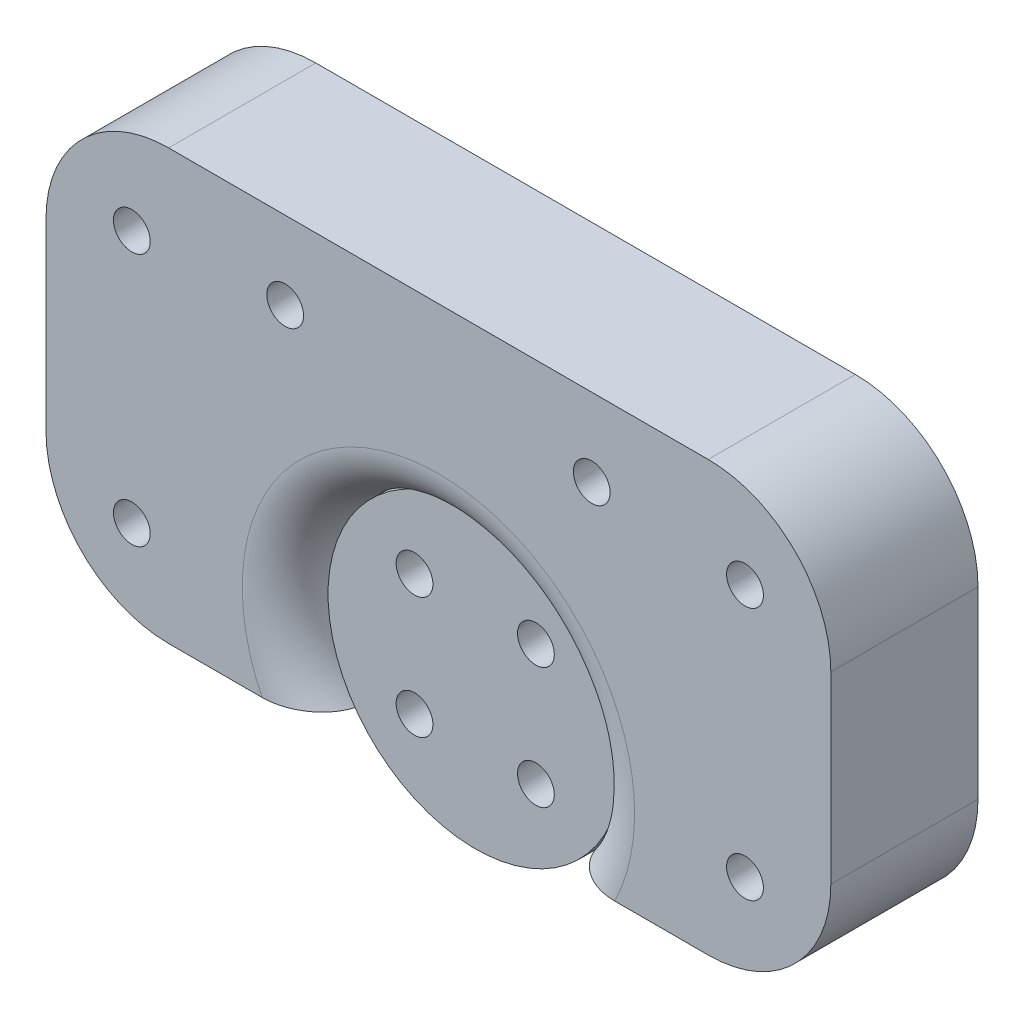
ISO-10303-21;
HEADER;
FILE_DESCRIPTION(('STEP AP214'),'2;1');
FILE_NAME('part.step','',(''),(''),'','','');
FILE_SCHEMA(('AUTOMOTIVE_DESIGN { 1 0 10303 214 1 1 1 1 }'));
ENDSEC;
DATA;
#1=APPLICATION_CONTEXT('core data for automotive mechanical design processes');
#2=APPLICATION_PROTOCOL_DEFINITION('international standard','automotive_design',2000,#1);
#3=PRODUCT_CONTEXT('',#1,'mechanical');
#4=PRODUCT('Part','Part','',(#3));
#5=PRODUCT_RELATED_PRODUCT_CATEGORY('part','',(#4));
#6=PRODUCT_DEFINITION_FORMATION('','',#4);
#7=PRODUCT_DEFINITION_CONTEXT('part definition',#1,'design');
#8=PRODUCT_DEFINITION('design','',#6,#7);
#9=PRODUCT_DEFINITION_SHAPE('','',#8);
#10=(LENGTH_UNIT() NAMED_UNIT(*) SI_UNIT(.MILLI.,.METRE.));
#11=(NAMED_UNIT(*) PLANE_ANGLE_UNIT() SI_UNIT($,.RADIAN.));
#12=(NAMED_UNIT(*) SI_UNIT($,.STERADIAN.) SOLID_ANGLE_UNIT());
#13=UNCERTAINTY_MEASURE_WITH_UNIT(LENGTH_MEASURE(1.E-05),#10,'distance_accuracy_value','');
#14=(GEOMETRIC_REPRESENTATION_CONTEXT(3) GLOBAL_UNCERTAINTY_ASSIGNED_CONTEXT((#13)) GLOBAL_UNIT_ASSIGNED_CONTEXT((#10,
#11,#12)) REPRESENTATION_CONTEXT('',''));
#15=CARTESIAN_POINT('',(0.,0.,0.));
#16=DIRECTION('',(0.,0.,1.));
#17=DIRECTION('',(1.,0.,0.));
#18=AXIS2_PLACEMENT_3D('',#15,#16,#17);
#19=CARTESIAN_POINT('',(32.,-7.,12.));
#20=DIRECTION('',(1.,0.,0.));
#21=DIRECTION('',(0.,0.,-1.));
#22=AXIS2_PLACEMENT_3D('',#19,#20,#21);
#23=PLANE('',#22);
#24=DIRECTION('',(0.,-1.,0.));
#25=VECTOR('',#24,1.);
#26=CARTESIAN_POINT('',(32.,-7.,0.));
#27=LINE('',#26,#25);
#28=CARTESIAN_POINT('',(32.,18.,0.));
#29=VERTEX_POINT('',#28);
#30=CARTESIAN_POINT('',(32.,3.,0.));
#31=VERTEX_POINT('',#30);
#32=EDGE_CURVE('E151',#29,#31,#27,.T.);
#33=ORIENTED_EDGE('',*,*,#32,.F.);
#34=DIRECTION('',(0.,0.,-1.));
#35=VECTOR('',#34,1.);
#36=CARTESIAN_POINT('',(32.,18.,12.));
#37=LINE('',#36,#35);
#38=CARTESIAN_POINT('',(32.,18.,12.));
#39=VERTEX_POINT('',#38);
#40=EDGE_CURVE('E244',#29,#39,#37,.F.);
#41=ORIENTED_EDGE('',*,*,#40,.T.);
#42=DIRECTION('',(0.,-1.,0.));
#43=VECTOR('',#42,1.);
#44=CARTESIAN_POINT('',(32.,-7.,12.));
#45=LINE('',#44,#43);
#46=CARTESIAN_POINT('',(32.,3.,12.));
#47=VERTEX_POINT('',#46);
#48=EDGE_CURVE('E182',#39,#47,#45,.T.);
#49=ORIENTED_EDGE('',*,*,#48,.T.);
#50=DIRECTION('',(0.,0.,-1.));
#51=VECTOR('',#50,1.);
#52=CARTESIAN_POINT('',(32.,3.,12.));
#53=LINE('',#52,#51);
#54=EDGE_CURVE('E247',#47,#31,#53,.T.);
#55=ORIENTED_EDGE('',*,*,#54,.T.);
#56=EDGE_LOOP('',(#33,#41,#49,#55));
#57=FACE_BOUND('',#56,.T.);
#58=ADVANCED_FACE('F53',(#57),#23,.T.);
#59=CARTESIAN_POINT('',(32.,28.,12.));
#60=DIRECTION('',(0.,1.,0.));
#61=DIRECTION('',(0.,0.,1.));
#62=AXIS2_PLACEMENT_3D('',#59,#60,#61);
#63=PLANE('',#62);
#64=DIRECTION('',(1.,0.,0.));
#65=VECTOR('',#64,1.);
#66=CARTESIAN_POINT('',(32.,28.,12.));
#67=LINE('',#66,#65);
#68=CARTESIAN_POINT('',(-22.,28.,12.));
#69=VERTEX_POINT('',#68);
#70=CARTESIAN_POINT('',(22.,28.,12.));
#71=VERTEX_POINT('',#70);
#72=EDGE_CURVE('E163',#69,#71,#67,.T.);
#73=ORIENTED_EDGE('',*,*,#72,.T.);
#74=DIRECTION('',(0.,0.,-1.));
#75=VECTOR('',#74,1.);
#76=CARTESIAN_POINT('',(22.,28.,12.));
#77=LINE('',#76,#75);
#78=CARTESIAN_POINT('',(22.,28.,0.));
#79=VERTEX_POINT('',#78);
#80=EDGE_CURVE('E287',#71,#79,#77,.T.);
#81=ORIENTED_EDGE('',*,*,#80,.T.);
#82=DIRECTION('',(1.,0.,0.));
#83=VECTOR('',#82,1.);
#84=CARTESIAN_POINT('',(32.,28.,0.));
#85=LINE('',#84,#83);
#86=CARTESIAN_POINT('',(-22.,28.,0.));
#87=VERTEX_POINT('',#86);
#88=EDGE_CURVE('E179',#87,#79,#85,.T.);
#89=ORIENTED_EDGE('',*,*,#88,.F.);
#90=DIRECTION('',(0.,0.,-1.));
#91=VECTOR('',#90,1.);
#92=CARTESIAN_POINT('',(-22.,28.,12.));
#93=LINE('',#92,#91);
#94=EDGE_CURVE('E220',#87,#69,#93,.F.);
#95=ORIENTED_EDGE('',*,*,#94,.T.);
#96=EDGE_LOOP('',(#73,#81,#89,#95));
#97=FACE_BOUND('',#96,.T.);
#98=ADVANCED_FACE('F233',(#97),#63,.T.);
#99=CARTESIAN_POINT('',(-32.,-7.,12.));
#100=DIRECTION('',(-1.,0.,0.));
#101=DIRECTION('',(0.,0.,1.));
#102=AXIS2_PLACEMENT_3D('',#99,#100,#101);
#103=PLANE('',#102);
#104=DIRECTION('',(0.,1.,0.));
#105=VECTOR('',#104,1.);
#106=CARTESIAN_POINT('',(-32.,-7.,12.));
#107=LINE('',#106,#105);
#108=CARTESIAN_POINT('',(-32.,3.,12.));
#109=VERTEX_POINT('',#108);
#110=CARTESIAN_POINT('',(-32.,18.,12.));
#111=VERTEX_POINT('',#110);
#112=EDGE_CURVE('E279',#109,#111,#107,.T.);
#113=ORIENTED_EDGE('',*,*,#112,.T.);
#114=DIRECTION('',(0.,0.,-1.));
#115=VECTOR('',#114,1.);
#116=CARTESIAN_POINT('',(-32.,18.,12.));
#117=LINE('',#116,#115);
#118=CARTESIAN_POINT('',(-32.,18.,0.));
#119=VERTEX_POINT('',#118);
#120=EDGE_CURVE('E62',#111,#119,#117,.T.);
#121=ORIENTED_EDGE('',*,*,#120,.T.);
#122=DIRECTION('',(0.,1.,0.));
#123=VECTOR('',#122,1.);
#124=CARTESIAN_POINT('',(-32.,-7.,0.));
#125=LINE('',#124,#123);
#126=CARTESIAN_POINT('',(-32.,3.,0.));
#127=VERTEX_POINT('',#126);
#128=EDGE_CURVE('E172',#127,#119,#125,.T.);
#129=ORIENTED_EDGE('',*,*,#128,.F.);
#130=DIRECTION('',(0.,0.,-1.));
#131=VECTOR('',#130,1.);
#132=CARTESIAN_POINT('',(-32.,3.,12.));
#133=LINE('',#132,#131);
#134=EDGE_CURVE('E76',#127,#109,#133,.F.);
#135=ORIENTED_EDGE('',*,*,#134,.T.);
#136=EDGE_LOOP('',(#113,#121,#129,#135));
#137=FACE_BOUND('',#136,.T.);
#138=ADVANCED_FACE('F230',(#137),#103,.T.);
#139=CARTESIAN_POINT('',(-18.,-7.,12.));
#140=DIRECTION('',(0.,-1.,0.));
#141=DIRECTION('',(0.,0.,-1.));
#142=AXIS2_PLACEMENT_3D('',#139,#140,#141);
#143=PLANE('',#142);
#144=DIRECTION('',(-1.,0.,0.));
#145=VECTOR('',#144,1.);
#146=CARTESIAN_POINT('',(-18.,-7.,12.));
#147=LINE('',#146,#145);
#148=CARTESIAN_POINT('',(-14.3844951701425,-7.,12.));
#149=VERTEX_POINT('',#148);
#150=CARTESIAN_POINT('',(-22.,-7.,12.));
#151=VERTEX_POINT('',#150);
#152=EDGE_CURVE('E305',#149,#151,#147,.T.);
#153=ORIENTED_EDGE('',*,*,#152,.T.);
#154=DIRECTION('',(0.,0.,-1.));
#155=VECTOR('',#154,1.);
#156=CARTESIAN_POINT('',(-22.,-7.,12.));
#157=LINE('',#156,#155);
#158=CARTESIAN_POINT('',(-22.,-7.,0.));
#159=VERTEX_POINT('',#158);
#160=EDGE_CURVE('E12',#151,#159,#157,.T.);
#161=ORIENTED_EDGE('',*,*,#160,.T.);
#162=DIRECTION('',(-1.,0.,0.));
#163=VECTOR('',#162,1.);
#164=CARTESIAN_POINT('',(-18.,-7.,0.));
#165=LINE('',#164,#163);
#166=CARTESIAN_POINT('',(-9.74347359997585,-7.,0.));
#167=VERTEX_POINT('',#166);
#168=EDGE_CURVE('E169',#167,#159,#165,.T.);
#169=ORIENTED_EDGE('',*,*,#168,.F.);
#170=DIRECTION('',(0.,0.,-1.));
#171=VECTOR('',#170,1.);
#172=CARTESIAN_POINT('',(-9.74347359997585,-7.,12.));
#173=LINE('',#172,#171);
#174=CARTESIAN_POINT('',(-9.74347359997585,-7.,8.));
#175=VERTEX_POINT('',#174);
#176=EDGE_CURVE('E162',#175,#167,#173,.T.);
#177=ORIENTED_EDGE('',*,*,#176,.F.);
#178=CARTESIAN_POINT('',(-9.74347359997585,-6.99999999999999,8.));
#179=CARTESIAN_POINT('',(-9.74344435468026,-7.,8.09903540453549));
#180=CARTESIAN_POINT('',(-9.74800147531695,-7.,8.19805527858989));
#181=CARTESIAN_POINT('',(-9.7660635012237,-7.,8.39521742407826));
#182=CARTESIAN_POINT('',(-9.77956299778887,-7.,8.49336018967864));
#183=CARTESIAN_POINT('',(-9.81517176348485,-7.,8.68742426261908));
#184=CARTESIAN_POINT('',(-9.83722574510368,-7.,8.78335572674818));
#185=CARTESIAN_POINT('',(-9.88953419181571,-7.,8.9729370594773));
#186=CARTESIAN_POINT('',(-9.91978952155813,-7.,9.06658668637323));
#187=CARTESIAN_POINT('',(-10.0220089013671,-7.,9.34277331369388));
#188=CARTESIAN_POINT('',(-10.1055401596682,-7.,9.52114621634541));
#189=CARTESIAN_POINT('',(-10.2990282342519,-7.,9.86299472026145));
#190=CARTESIAN_POINT('',(-10.409026437671,-7.,10.0264464311085));
#191=CARTESIAN_POINT('',(-10.6613444605034,-7.,10.3494218275154));
#192=CARTESIAN_POINT('',(-10.8056262668084,-7.,10.5074086369044));
#193=CARTESIAN_POINT('',(-11.114990238316,-7.,10.8013536810068));
#194=CARTESIAN_POINT('',(-11.2800783639962,-7.,10.9373055776671));
#195=CARTESIAN_POINT('',(-11.657567613096,-7.,11.2080968727196));
#196=CARTESIAN_POINT('',(-11.8731718142114,-7.,11.3384833234905));
#197=CARTESIAN_POINT('',(-12.3214365875418,-7.,11.5656244386296));
#198=CARTESIAN_POINT('',(-12.5541078209284,-7.,11.662357860743));
#199=CARTESIAN_POINT('',(-13.0489609077403,-7.,11.826471220613));
#200=CARTESIAN_POINT('',(-13.312052619614,-7.,11.891150889228));
#201=CARTESIAN_POINT('',(-13.7115959820381,-7.,11.9562207677958));
#202=CARTESIAN_POINT('',(-13.8456257355746,-7.,11.9725858752748));
#203=CARTESIAN_POINT('',(-14.1145778103885,-7.,11.9944726100521));
#204=CARTESIAN_POINT('',(-14.2495002083533,-7.,11.9999932932401));
#205=CARTESIAN_POINT('',(-14.3844951701425,-7.,12.));
#206=B_SPLINE_CURVE_WITH_KNOTS('',3,(#178,#179,#180,#181,#182,#183,#184,#185,#186,#187,#188,
#189,#190,#191,#192,#193,#194,#195,#196,#197,#198,#199,#200,#201,#202,#203,#204,#205),
.UNSPECIFIED.,.F.,.F.,(4,2,2,2,2,2,2,2,2,2,2,2,2,4),(0.,0.29697595807614,0.59377245708094,
0.888681894468127,1.18362243557811,1.77170035420194,2.36070391319661,3.00018092735352,
3.63984155348818,4.39268051234584,5.14599381496966,5.95502468367447,6.35972400139915,
6.76445855048876),.UNSPECIFIED.);
#207=EDGE_CURVE('E188',#175,#149,#206,.T.);
#208=ORIENTED_EDGE('',*,*,#207,.T.);
#209=EDGE_LOOP('',(#153,#161,#169,#177,#208));
#210=FACE_BOUND('',#209,.T.);
#211=ADVANCED_FACE('F199',(#210),#143,.T.);
#212=CARTESIAN_POINT('',(0.,0.,12.));
#213=DIRECTION('',(0.,0.,-1.));
#214=DIRECTION('',(-1.,0.,0.));
#215=AXIS2_PLACEMENT_3D('',#212,#213,#214);
#216=CYLINDRICAL_SURFACE('',#215,11.9973029383035);
#217=DIRECTION('',(0.,0.,-1.));
#218=VECTOR('',#217,1.);
#219=CARTESIAN_POINT('',(9.74347359997584,-7.,12.));
#220=LINE('',#219,#218);
#221=CARTESIAN_POINT('',(9.74347359997584,-7.,8.));
#222=VERTEX_POINT('',#221);
#223=CARTESIAN_POINT('',(9.74347359997584,-7.,0.));
#224=VERTEX_POINT('',#223);
#225=EDGE_CURVE('E154',#222,#224,#220,.T.);
#226=ORIENTED_EDGE('',*,*,#225,.F.);
#227=CARTESIAN_POINT('',(0.,0.,8.));
#228=DIRECTION('',(0.,0.,1.));
#229=DIRECTION('',(1.,0.,0.));
#230=AXIS2_PLACEMENT_3D('',#227,#228,#229);
#231=CIRCLE('',#230,11.9973029383035);
#232=EDGE_CURVE('E184',#222,#175,#231,.T.);
#233=ORIENTED_EDGE('',*,*,#232,.T.);
#234=ORIENTED_EDGE('',*,*,#176,.T.);
#235=CARTESIAN_POINT('',(0.,0.,0.));
#236=DIRECTION('',(0.,0.,1.));
#237=DIRECTION('',(1.,0.,0.));
#238=AXIS2_PLACEMENT_3D('',#235,#236,#237);
#239=CIRCLE('',#238,11.9973029383035);
#240=EDGE_CURVE('E145',#224,#167,#239,.T.);
#241=ORIENTED_EDGE('',*,*,#240,.F.);
#242=EDGE_LOOP('',(#226,#233,#234,#241));
#243=FACE_BOUND('',#242,.T.);
#244=ADVANCED_FACE('F165',(#243),#216,.F.);
#245=CARTESIAN_POINT('',(18.,-7.,12.));
#246=DIRECTION('',(0.,-1.,0.));
#247=DIRECTION('',(0.,0.,-1.));
#248=AXIS2_PLACEMENT_3D('',#245,#246,#247);
#249=PLANE('',#248);
#250=DIRECTION('',(-1.,0.,0.));
#251=VECTOR('',#250,1.);
#252=CARTESIAN_POINT('',(18.,-7.,0.));
#253=LINE('',#252,#251);
#254=CARTESIAN_POINT('',(22.,-7.,0.));
#255=VERTEX_POINT('',#254);
#256=EDGE_CURVE('E139',#255,#224,#253,.T.);
#257=ORIENTED_EDGE('',*,*,#256,.F.);
#258=DIRECTION('',(0.,0.,-1.));
#259=VECTOR('',#258,1.);
#260=CARTESIAN_POINT('',(22.,-7.,12.));
#261=LINE('',#260,#259);
#262=CARTESIAN_POINT('',(22.,-7.,12.));
#263=VERTEX_POINT('',#262);
#264=EDGE_CURVE('E272',#255,#263,#261,.F.);
#265=ORIENTED_EDGE('',*,*,#264,.T.);
#266=DIRECTION('',(-1.,0.,0.));
#267=VECTOR('',#266,1.);
#268=CARTESIAN_POINT('',(18.,-7.,12.));
#269=LINE('',#268,#267);
#270=CARTESIAN_POINT('',(14.3844951701425,-7.,12.));
#271=VERTEX_POINT('',#270);
#272=EDGE_CURVE('E309',#263,#271,#269,.T.);
#273=ORIENTED_EDGE('',*,*,#272,.T.);
#274=CARTESIAN_POINT('',(14.3844951701425,-7.,12.));
#275=CARTESIAN_POINT('',(14.2420878034501,-7.,11.9999918462572));
#276=CARTESIAN_POINT('',(14.0997639616411,-7.,11.9938486990009));
#277=CARTESIAN_POINT('',(13.8161726647534,-7.,11.9695080152988));
#278=CARTESIAN_POINT('',(13.6749050381497,-7.,11.9513124810878));
#279=CARTESIAN_POINT('',(13.2540753677127,-7.,11.8789892042394));
#280=CARTESIAN_POINT('',(12.9773566716383,-7.,11.8071243886796));
#281=CARTESIAN_POINT('',(12.4399485206832,-7.,11.6184606138705));
#282=CARTESIAN_POINT('',(12.1792558412528,-7.,11.5016707284146));
#283=CARTESIAN_POINT('',(11.6811367108985,-7.,11.225082442151));
#284=CARTESIAN_POINT('',(11.4437243737843,-7.,11.0652581687921));
#285=CARTESIAN_POINT('',(11.1144366523795,-7.,10.7970269880186));
#286=CARTESIAN_POINT('',(11.0099376038794,-7.,10.7037930959022));
#287=CARTESIAN_POINT('',(10.8100806957832,-7.,10.5078916237115));
#288=CARTESIAN_POINT('',(10.7147238297694,-7.,10.4052230206321));
#289=CARTESIAN_POINT('',(10.5347793966114,-7.,10.1911549407358));
#290=CARTESIAN_POINT('',(10.4501724686068,-7.,10.0797717611115));
#291=CARTESIAN_POINT('',(10.2930836227132,-7.,9.84878001380215));
#292=CARTESIAN_POINT('',(10.220595422069,-7.,9.72917575387183));
#293=CARTESIAN_POINT('',(10.1093021436052,-7.,9.52014944091777));
#294=CARTESIAN_POINT('',(10.0669548911726,-7.,9.43259889260354));
#295=CARTESIAN_POINT('',(9.9894542494377,-7.,9.25437717310283));
#296=CARTESIAN_POINT('',(9.95429907958891,-7.,9.16370678080663));
#297=CARTESIAN_POINT('',(9.89175084376281,-7.,8.97992038185409));
#298=CARTESIAN_POINT('',(9.86434272712411,-7.,8.88680950663223));
#299=CARTESIAN_POINT('',(9.81764653158855,-7.,8.69860295312347));
#300=CARTESIAN_POINT('',(9.79835514254626,-7.,8.60350810057674));
#301=CARTESIAN_POINT('',(9.77007851401837,-7.,8.42379975043481));
#302=CARTESIAN_POINT('',(9.76011604115591,-7.,8.33933908103979));
#303=CARTESIAN_POINT('',(9.74680660472471,-7.,8.16992242806712));
#304=CARTESIAN_POINT('',(9.74345782979096,-7.,8.08496658650257));
#305=CARTESIAN_POINT('',(9.74347359997584,-7.,8.));
#306=B_SPLINE_CURVE_WITH_KNOTS('',3,(#274,#275,#276,#277,#278,#279,#280,#281,#282,#283,#284,
#285,#286,#287,#288,#289,#290,#291,#292,#293,#294,#295,#296,#297,#298,#299,#300,#301,#302,#303,
#304,#305),.UNSPECIFIED.,.F.,.F.,(4,2,2,2,2,2,2,2,2,2,2,2,2,2,2,4),(0.,0.426931991220559,
0.853793075009467,1.70713059538303,2.56029585233593,3.4139751874524,3.83361525085187,
4.25330086960513,4.67221957590167,5.09092042262879,5.38239974402468,5.67380681621873,
5.96464380110228,6.25536206227089,6.51024681017978,6.76506174035942),.UNSPECIFIED.);
#307=EDGE_CURVE('E157',#271,#222,#306,.T.);
#308=ORIENTED_EDGE('',*,*,#307,.T.);
#309=ORIENTED_EDGE('',*,*,#225,.T.);
#310=EDGE_LOOP('',(#257,#265,#273,#308,#309));
#311=FACE_BOUND('',#310,.T.);
#312=ADVANCED_FACE('F155',(#311),#249,.T.);
#313=CARTESIAN_POINT('',(0.,0.,12.));
#314=DIRECTION('',(0.,0.,1.));
#315=DIRECTION('',(1.,0.,0.));
#316=AXIS2_PLACEMENT_3D('',#313,#314,#315);
#317=PLANE('',#316);
#318=CARTESIAN_POINT('',(-25.,0.,12.));
#319=DIRECTION('',(0.,0.,-1.));
#320=DIRECTION('',(-1.,0.,0.));
#321=AXIS2_PLACEMENT_3D('',#318,#319,#320);
#322=CIRCLE('',#321,1.5);
#323=CARTESIAN_POINT('',(-26.5,0.,12.));
#324=VERTEX_POINT('',#323);
#325=EDGE_CURVE('E351',#324,#324,#322,.T.);
#326=ORIENTED_EDGE('',*,*,#325,.T.);
#327=EDGE_LOOP('',(#326));
#328=FACE_BOUND('',#327,.T.);
#329=CARTESIAN_POINT('',(25.,0.,12.));
#330=DIRECTION('',(0.,0.,-1.));
#331=DIRECTION('',(-1.,0.,0.));
#332=AXIS2_PLACEMENT_3D('',#329,#330,#331);
#333=CIRCLE('',#332,1.5);
#334=CARTESIAN_POINT('',(23.5,0.,12.));
#335=VERTEX_POINT('',#334);
#336=EDGE_CURVE('E343',#335,#335,#333,.T.);
#337=ORIENTED_EDGE('',*,*,#336,.T.);
#338=EDGE_LOOP('',(#337));
#339=FACE_BOUND('',#338,.T.);
#340=CARTESIAN_POINT('',(-25.,20.65,12.));
#341=DIRECTION('',(0.,0.,-1.));
#342=DIRECTION('',(-1.,0.,0.));
#343=AXIS2_PLACEMENT_3D('',#340,#341,#342);
#344=CIRCLE('',#343,1.5);
#345=CARTESIAN_POINT('',(-26.5,20.65,12.));
#346=VERTEX_POINT('',#345);
#347=EDGE_CURVE('E335',#346,#346,#344,.T.);
#348=ORIENTED_EDGE('',*,*,#347,.T.);
#349=EDGE_LOOP('',(#348));
#350=FACE_BOUND('',#349,.T.);
#351=CARTESIAN_POINT('',(25.,20.65,12.));
#352=DIRECTION('',(0.,0.,-1.));
#353=DIRECTION('',(-1.,0.,0.));
#354=AXIS2_PLACEMENT_3D('',#351,#352,#353);
#355=CIRCLE('',#354,1.5);
#356=CARTESIAN_POINT('',(23.5,20.65,12.));
#357=VERTEX_POINT('',#356);
#358=EDGE_CURVE('E327',#357,#357,#355,.T.);
#359=ORIENTED_EDGE('',*,*,#358,.T.);
#360=EDGE_LOOP('',(#359));
#361=FACE_BOUND('',#360,.T.);
#362=CARTESIAN_POINT('',(12.5,21.65,12.));
#363=DIRECTION('',(0.,0.,-1.));
#364=DIRECTION('',(-1.,0.,0.));
#365=AXIS2_PLACEMENT_3D('',#362,#363,#364);
#366=CIRCLE('',#365,1.5);
#367=CARTESIAN_POINT('',(11.,21.65,12.));
#368=VERTEX_POINT('',#367);
#369=EDGE_CURVE('E319',#368,#368,#366,.T.);
#370=ORIENTED_EDGE('',*,*,#369,.T.);
#371=EDGE_LOOP('',(#370));
#372=FACE_BOUND('',#371,.T.);
#373=CARTESIAN_POINT('',(-12.5,21.65,12.));
#374=DIRECTION('',(0.,0.,-1.));
#375=DIRECTION('',(-1.,0.,0.));
#376=AXIS2_PLACEMENT_3D('',#373,#374,#375);
#377=CIRCLE('',#376,1.5);
#378=CARTESIAN_POINT('',(-14.,21.65,12.));
#379=VERTEX_POINT('',#378);
#380=EDGE_CURVE('E249',#379,#379,#377,.T.);
#381=ORIENTED_EDGE('',*,*,#380,.T.);
#382=EDGE_LOOP('',(#381));
#383=FACE_BOUND('',#382,.T.);
#384=ORIENTED_EDGE('',*,*,#48,.F.);
#385=CARTESIAN_POINT('',(22.,18.,12.));
#386=DIRECTION('',(0.,0.,1.));
#387=DIRECTION('',(1.,0.,0.));
#388=AXIS2_PLACEMENT_3D('',#385,#386,#387);
#389=CIRCLE('',#388,10.);
#390=EDGE_CURVE('E255',#39,#71,#389,.T.);
#391=ORIENTED_EDGE('',*,*,#390,.T.);
#392=ORIENTED_EDGE('',*,*,#72,.F.);
#393=CARTESIAN_POINT('',(-22.,18.,12.));
#394=DIRECTION('',(0.,0.,1.));
#395=DIRECTION('',(1.,0.,0.));
#396=AXIS2_PLACEMENT_3D('',#393,#394,#395);
#397=CIRCLE('',#396,10.);
#398=EDGE_CURVE('E69',#69,#111,#397,.T.);
#399=ORIENTED_EDGE('',*,*,#398,.T.);
#400=ORIENTED_EDGE('',*,*,#112,.F.);
#401=CARTESIAN_POINT('',(-22.,3.,12.));
#402=DIRECTION('',(0.,0.,1.));
#403=DIRECTION('',(1.,0.,0.));
#404=AXIS2_PLACEMENT_3D('',#401,#402,#403);
#405=CIRCLE('',#404,10.);
#406=EDGE_CURVE('E257',#109,#151,#405,.T.);
#407=ORIENTED_EDGE('',*,*,#406,.T.);
#408=ORIENTED_EDGE('',*,*,#152,.F.);
#409=CARTESIAN_POINT('',(0.,0.,12.));
#410=DIRECTION('',(0.,0.,1.));
#411=DIRECTION('',(1.,0.,0.));
#412=AXIS2_PLACEMENT_3D('',#409,#410,#411);
#413=CIRCLE('',#412,15.9973029383035);
#414=EDGE_CURVE('E197',#149,#271,#413,.F.);
#415=ORIENTED_EDGE('',*,*,#414,.T.);
#416=ORIENTED_EDGE('',*,*,#272,.F.);
#417=CARTESIAN_POINT('',(22.,3.,12.));
#418=DIRECTION('',(0.,0.,1.));
#419=DIRECTION('',(1.,0.,0.));
#420=AXIS2_PLACEMENT_3D('',#417,#418,#419);
#421=CIRCLE('',#420,10.);
#422=EDGE_CURVE('E267',#263,#47,#421,.T.);
#423=ORIENTED_EDGE('',*,*,#422,.T.);
#424=EDGE_LOOP('',(#384,#391,#392,#399,#400,#407,#408,#415,#416,#423));
#425=FACE_BOUND('',#424,.T.);
#426=ADVANCED_FACE('F224',(#328,#339,#350,#361,#372,#383,#425),#317,.T.);
#427=CARTESIAN_POINT('',(0.,0.,0.));
#428=DIRECTION('',(0.,0.,1.));
#429=DIRECTION('',(1.,0.,0.));
#430=AXIS2_PLACEMENT_3D('',#427,#428,#429);
#431=PLANE('',#430);
#432=CARTESIAN_POINT('',(-25.,0.,0.));
#433=DIRECTION('',(0.,0.,-1.));
#434=DIRECTION('',(-1.,0.,0.));
#435=AXIS2_PLACEMENT_3D('',#432,#433,#434);
#436=CIRCLE('',#435,1.5);
#437=CARTESIAN_POINT('',(-26.5,0.,0.));
#438=VERTEX_POINT('',#437);
#439=EDGE_CURVE('E355',#438,#438,#436,.T.);
#440=ORIENTED_EDGE('',*,*,#439,.F.);
#441=EDGE_LOOP('',(#440));
#442=FACE_BOUND('',#441,.T.);
#443=CARTESIAN_POINT('',(25.,0.,0.));
#444=DIRECTION('',(0.,0.,-1.));
#445=DIRECTION('',(-1.,0.,0.));
#446=AXIS2_PLACEMENT_3D('',#443,#444,#445);
#447=CIRCLE('',#446,1.5);
#448=CARTESIAN_POINT('',(23.5,0.,0.));
#449=VERTEX_POINT('',#448);
#450=EDGE_CURVE('E347',#449,#449,#447,.T.);
#451=ORIENTED_EDGE('',*,*,#450,.F.);
#452=EDGE_LOOP('',(#451));
#453=FACE_BOUND('',#452,.T.);
#454=CARTESIAN_POINT('',(-25.,20.65,0.));
#455=DIRECTION('',(0.,0.,-1.));
#456=DIRECTION('',(-1.,0.,0.));
#457=AXIS2_PLACEMENT_3D('',#454,#455,#456);
#458=CIRCLE('',#457,1.5);
#459=CARTESIAN_POINT('',(-26.5,20.65,0.));
#460=VERTEX_POINT('',#459);
#461=EDGE_CURVE('E339',#460,#460,#458,.T.);
#462=ORIENTED_EDGE('',*,*,#461,.F.);
#463=EDGE_LOOP('',(#462));
#464=FACE_BOUND('',#463,.T.);
#465=CARTESIAN_POINT('',(25.,20.65,0.));
#466=DIRECTION('',(0.,0.,-1.));
#467=DIRECTION('',(-1.,0.,0.));
#468=AXIS2_PLACEMENT_3D('',#465,#466,#467);
#469=CIRCLE('',#468,1.5);
#470=CARTESIAN_POINT('',(23.5,20.65,0.));
#471=VERTEX_POINT('',#470);
#472=EDGE_CURVE('E331',#471,#471,#469,.T.);
#473=ORIENTED_EDGE('',*,*,#472,.F.);
#474=EDGE_LOOP('',(#473));
#475=FACE_BOUND('',#474,.T.);
#476=CARTESIAN_POINT('',(12.5,21.65,0.));
#477=DIRECTION('',(0.,0.,-1.));
#478=DIRECTION('',(-1.,0.,0.));
#479=AXIS2_PLACEMENT_3D('',#476,#477,#478);
#480=CIRCLE('',#479,1.5);
#481=CARTESIAN_POINT('',(11.,21.65,0.));
#482=VERTEX_POINT('',#481);
#483=EDGE_CURVE('E323',#482,#482,#480,.T.);
#484=ORIENTED_EDGE('',*,*,#483,.F.);
#485=EDGE_LOOP('',(#484));
#486=FACE_BOUND('',#485,.T.);
#487=CARTESIAN_POINT('',(-12.5,21.65,0.));
#488=DIRECTION('',(0.,0.,-1.));
#489=DIRECTION('',(-1.,0.,0.));
#490=AXIS2_PLACEMENT_3D('',#487,#488,#489);
#491=CIRCLE('',#490,1.5);
#492=CARTESIAN_POINT('',(-14.,21.65,0.));
#493=VERTEX_POINT('',#492);
#494=EDGE_CURVE('E315',#493,#493,#491,.T.);
#495=ORIENTED_EDGE('',*,*,#494,.F.);
#496=EDGE_LOOP('',(#495));
#497=FACE_BOUND('',#496,.T.);
#498=ORIENTED_EDGE('',*,*,#88,.T.);
#499=CARTESIAN_POINT('',(22.,18.,0.));
#500=DIRECTION('',(0.,0.,1.));
#501=DIRECTION('',(1.,0.,0.));
#502=AXIS2_PLACEMENT_3D('',#499,#500,#501);
#503=CIRCLE('',#502,10.);
#504=EDGE_CURVE('E253',#79,#29,#503,.F.);
#505=ORIENTED_EDGE('',*,*,#504,.T.);
#506=ORIENTED_EDGE('',*,*,#32,.T.);
#507=CARTESIAN_POINT('',(22.,3.,0.));
#508=DIRECTION('',(0.,0.,1.));
#509=DIRECTION('',(1.,0.,0.));
#510=AXIS2_PLACEMENT_3D('',#507,#508,#509);
#511=CIRCLE('',#510,10.);
#512=EDGE_CURVE('E147',#31,#255,#511,.F.);
#513=ORIENTED_EDGE('',*,*,#512,.T.);
#514=ORIENTED_EDGE('',*,*,#256,.T.);
#515=ORIENTED_EDGE('',*,*,#240,.T.);
#516=ORIENTED_EDGE('',*,*,#168,.T.);
#517=CARTESIAN_POINT('',(-22.,3.,0.));
#518=DIRECTION('',(0.,0.,1.));
#519=DIRECTION('',(1.,0.,0.));
#520=AXIS2_PLACEMENT_3D('',#517,#518,#519);
#521=CIRCLE('',#520,10.);
#522=EDGE_CURVE('E283',#159,#127,#521,.F.);
#523=ORIENTED_EDGE('',*,*,#522,.T.);
#524=ORIENTED_EDGE('',*,*,#128,.T.);
#525=CARTESIAN_POINT('',(-22.,18.,0.));
#526=DIRECTION('',(0.,0.,1.));
#527=DIRECTION('',(1.,0.,0.));
#528=AXIS2_PLACEMENT_3D('',#525,#526,#527);
#529=CIRCLE('',#528,10.);
#530=EDGE_CURVE('E281',#119,#87,#529,.F.);
#531=ORIENTED_EDGE('',*,*,#530,.T.);
#532=EDGE_LOOP('',(#498,#505,#506,#513,#514,#515,#516,#523,#524,#531));
#533=FACE_BOUND('',#532,.T.);
#534=ADVANCED_FACE('F142',(#442,#453,#464,#475,#486,#497,#533),#431,.F.);
#535=CARTESIAN_POINT('',(-12.5,21.65,12.));
#536=DIRECTION('',(0.,0.,-1.));
#537=DIRECTION('',(-1.,0.,0.));
#538=AXIS2_PLACEMENT_3D('',#535,#536,#537);
#539=CYLINDRICAL_SURFACE('',#538,1.5);
#540=ORIENTED_EDGE('',*,*,#380,.F.);
#541=EDGE_LOOP('',(#540));
#542=FACE_BOUND('',#541,.T.);
#543=ORIENTED_EDGE('',*,*,#494,.T.);
#544=EDGE_LOOP('',(#543));
#545=FACE_BOUND('',#544,.T.);
#546=ADVANCED_FACE('F372',(#542,#545),#539,.F.);
#547=CARTESIAN_POINT('',(12.5,21.65,12.));
#548=DIRECTION('',(0.,0.,-1.));
#549=DIRECTION('',(-1.,0.,0.));
#550=AXIS2_PLACEMENT_3D('',#547,#548,#549);
#551=CYLINDRICAL_SURFACE('',#550,1.5);
#552=ORIENTED_EDGE('',*,*,#369,.F.);
#553=EDGE_LOOP('',(#552));
#554=FACE_BOUND('',#553,.T.);
#555=ORIENTED_EDGE('',*,*,#483,.T.);
#556=EDGE_LOOP('',(#555));
#557=FACE_BOUND('',#556,.T.);
#558=ADVANCED_FACE('F385',(#554,#557),#551,.F.);
#559=CARTESIAN_POINT('',(25.,20.65,12.));
#560=DIRECTION('',(0.,0.,-1.));
#561=DIRECTION('',(-1.,0.,0.));
#562=AXIS2_PLACEMENT_3D('',#559,#560,#561);
#563=CYLINDRICAL_SURFACE('',#562,1.5);
#564=ORIENTED_EDGE('',*,*,#358,.F.);
#565=EDGE_LOOP('',(#564));
#566=FACE_BOUND('',#565,.T.);
#567=ORIENTED_EDGE('',*,*,#472,.T.);
#568=EDGE_LOOP('',(#567));
#569=FACE_BOUND('',#568,.T.);
#570=ADVANCED_FACE('F391',(#566,#569),#563,.F.);
#571=CARTESIAN_POINT('',(-25.,20.65,12.));
#572=DIRECTION('',(0.,0.,-1.));
#573=DIRECTION('',(-1.,0.,0.));
#574=AXIS2_PLACEMENT_3D('',#571,#572,#573);
#575=CYLINDRICAL_SURFACE('',#574,1.5);
#576=ORIENTED_EDGE('',*,*,#347,.F.);
#577=EDGE_LOOP('',(#576));
#578=FACE_BOUND('',#577,.T.);
#579=ORIENTED_EDGE('',*,*,#461,.T.);
#580=EDGE_LOOP('',(#579));
#581=FACE_BOUND('',#580,.T.);
#582=ADVANCED_FACE('F471',(#578,#581),#575,.F.);
#583=CARTESIAN_POINT('',(25.,0.,12.));
#584=DIRECTION('',(0.,0.,-1.));
#585=DIRECTION('',(-1.,0.,0.));
#586=AXIS2_PLACEMENT_3D('',#583,#584,#585);
#587=CYLINDRICAL_SURFACE('',#586,1.5);
#588=ORIENTED_EDGE('',*,*,#336,.F.);
#589=EDGE_LOOP('',(#588));
#590=FACE_BOUND('',#589,.T.);
#591=ORIENTED_EDGE('',*,*,#450,.T.);
#592=EDGE_LOOP('',(#591));
#593=FACE_BOUND('',#592,.T.);
#594=ADVANCED_FACE('F366',(#590,#593),#587,.F.);
#595=CARTESIAN_POINT('',(-25.,0.,12.));
#596=DIRECTION('',(0.,0.,-1.));
#597=DIRECTION('',(-1.,0.,0.));
#598=AXIS2_PLACEMENT_3D('',#595,#596,#597);
#599=CYLINDRICAL_SURFACE('',#598,1.5);
#600=ORIENTED_EDGE('',*,*,#325,.F.);
#601=EDGE_LOOP('',(#600));
#602=FACE_BOUND('',#601,.T.);
#603=ORIENTED_EDGE('',*,*,#439,.T.);
#604=EDGE_LOOP('',(#603));
#605=FACE_BOUND('',#604,.T.);
#606=ADVANCED_FACE('F209',(#602,#605),#599,.F.);
#607=CARTESIAN_POINT('',(0.,0.,8.));
#608=DIRECTION('',(0.,0.,1.));
#609=DIRECTION('',(1.,0.,0.));
#610=AXIS2_PLACEMENT_3D('',#607,#608,#609);
#611=TOROIDAL_SURFACE('',#610,15.9973029383035,4.);
#612=ORIENTED_EDGE('',*,*,#307,.F.);
#613=ORIENTED_EDGE('',*,*,#414,.F.);
#614=ORIENTED_EDGE('',*,*,#207,.F.);
#615=ORIENTED_EDGE('',*,*,#232,.F.);
#616=EDGE_LOOP('',(#612,#613,#614,#615));
#617=FACE_BOUND('',#616,.T.);
#618=ADVANCED_FACE('F203',(#617),#611,.T.);
#619=CARTESIAN_POINT('',(22.,18.,12.));
#620=DIRECTION('',(0.,0.,-1.));
#621=DIRECTION('',(-1.,0.,0.));
#622=AXIS2_PLACEMENT_3D('',#619,#620,#621);
#623=CYLINDRICAL_SURFACE('',#622,10.);
#624=ORIENTED_EDGE('',*,*,#390,.F.);
#625=ORIENTED_EDGE('',*,*,#40,.F.);
#626=ORIENTED_EDGE('',*,*,#504,.F.);
#627=ORIENTED_EDGE('',*,*,#80,.F.);
#628=EDGE_LOOP('',(#624,#625,#626,#627));
#629=FACE_BOUND('',#628,.T.);
#630=ADVANCED_FACE('F208',(#629),#623,.T.);
#631=CARTESIAN_POINT('',(22.,3.,12.));
#632=DIRECTION('',(0.,0.,-1.));
#633=DIRECTION('',(-1.,0.,0.));
#634=AXIS2_PLACEMENT_3D('',#631,#632,#633);
#635=CYLINDRICAL_SURFACE('',#634,10.);
#636=ORIENTED_EDGE('',*,*,#422,.F.);
#637=ORIENTED_EDGE('',*,*,#264,.F.);
#638=ORIENTED_EDGE('',*,*,#512,.F.);
#639=ORIENTED_EDGE('',*,*,#54,.F.);
#640=EDGE_LOOP('',(#636,#637,#638,#639));
#641=FACE_BOUND('',#640,.T.);
#642=ADVANCED_FACE('F430',(#641),#635,.T.);
#643=CARTESIAN_POINT('',(-22.,18.,12.));
#644=DIRECTION('',(0.,0.,-1.));
#645=DIRECTION('',(-1.,0.,0.));
#646=AXIS2_PLACEMENT_3D('',#643,#644,#645);
#647=CYLINDRICAL_SURFACE('',#646,10.);
#648=ORIENTED_EDGE('',*,*,#398,.F.);
#649=ORIENTED_EDGE('',*,*,#94,.F.);
#650=ORIENTED_EDGE('',*,*,#530,.F.);
#651=ORIENTED_EDGE('',*,*,#120,.F.);
#652=EDGE_LOOP('',(#648,#649,#650,#651));
#653=FACE_BOUND('',#652,.T.);
#654=ADVANCED_FACE('F297',(#653),#647,.T.);
#655=CARTESIAN_POINT('',(-22.,3.,12.));
#656=DIRECTION('',(0.,0.,-1.));
#657=DIRECTION('',(-1.,0.,0.));
#658=AXIS2_PLACEMENT_3D('',#655,#656,#657);
#659=CYLINDRICAL_SURFACE('',#658,10.);
#660=ORIENTED_EDGE('',*,*,#406,.F.);
#661=ORIENTED_EDGE('',*,*,#134,.F.);
#662=ORIENTED_EDGE('',*,*,#522,.F.);
#663=ORIENTED_EDGE('',*,*,#160,.F.);
#664=EDGE_LOOP('',(#660,#661,#662,#663));
#665=FACE_BOUND('',#664,.T.);
#666=ADVANCED_FACE('F55',(#665),#659,.T.);
#667=CLOSED_SHELL('',(#58,#98,#138,#211,#244,#312,#426,#534,#546,#558,#570,#582,#594,#606,#618,
#630,#642,#654,#666));
#668=MANIFOLD_SOLID_BREP('B2',#667);
#669=CARTESIAN_POINT('',(0.,0.,9.));
#670=DIRECTION('',(0.,0.,1.));
#671=DIRECTION('',(1.,0.,0.));
#672=AXIS2_PLACEMENT_3D('',#669,#670,#671);
#673=PLANE('',#672);
#674=CARTESIAN_POINT('',(-4.94974746830582,-4.94974746830584,9.));
#675=DIRECTION('',(0.,0.,1.));
#676=DIRECTION('',(1.,0.,0.));
#677=AXIS2_PLACEMENT_3D('',#674,#675,#676);
#678=CIRCLE('',#677,1.5);
#679=CARTESIAN_POINT('',(-3.44974746830582,-4.94974746830584,9.));
#680=VERTEX_POINT('',#679);
#681=EDGE_CURVE('E570',#680,#680,#678,.T.);
#682=ORIENTED_EDGE('',*,*,#681,.F.);
#683=EDGE_LOOP('',(#682));
#684=FACE_BOUND('',#683,.T.);
#685=CARTESIAN_POINT('',(-4.94974746830582,4.94974746830584,9.));
#686=DIRECTION('',(0.,0.,1.));
#687=DIRECTION('',(1.,0.,0.));
#688=AXIS2_PLACEMENT_3D('',#685,#686,#687);
#689=CIRCLE('',#688,1.5);
#690=CARTESIAN_POINT('',(-3.44974746830582,4.94974746830584,9.));
#691=VERTEX_POINT('',#690);
#692=EDGE_CURVE('E559',#691,#691,#689,.T.);
#693=ORIENTED_EDGE('',*,*,#692,.F.);
#694=EDGE_LOOP('',(#693));
#695=FACE_BOUND('',#694,.T.);
#696=CARTESIAN_POINT('',(0.,0.,9.));
#697=DIRECTION('',(0.,0.,1.));
#698=DIRECTION('',(1.,0.,0.));
#699=AXIS2_PLACEMENT_3D('',#696,#697,#698);
#700=CIRCLE('',#699,12.);
#701=CARTESIAN_POINT('',(12.,0.,9.));
#702=VERTEX_POINT('',#701);
#703=EDGE_CURVE('E52',#702,#702,#700,.T.);
#704=ORIENTED_EDGE('',*,*,#703,.T.);
#705=EDGE_LOOP('',(#704));
#706=FACE_BOUND('',#705,.T.);
#707=CARTESIAN_POINT('',(4.94974746830583,4.94974746830584,9.));
#708=DIRECTION('',(0.,0.,1.));
#709=DIRECTION('',(1.,0.,0.));
#710=AXIS2_PLACEMENT_3D('',#707,#708,#709);
#711=CIRCLE('',#710,1.5);
#712=CARTESIAN_POINT('',(6.44974746830583,4.94974746830584,9.));
#713=VERTEX_POINT('',#712);
#714=EDGE_CURVE('E564',#713,#713,#711,.T.);
#715=ORIENTED_EDGE('',*,*,#714,.F.);
#716=EDGE_LOOP('',(#715));
#717=FACE_BOUND('',#716,.T.);
#718=CARTESIAN_POINT('',(4.94974746830582,-4.94974746830584,9.));
#719=DIRECTION('',(0.,0.,1.));
#720=DIRECTION('',(1.,0.,0.));
#721=AXIS2_PLACEMENT_3D('',#718,#719,#720);
#722=CIRCLE('',#721,1.5);
#723=CARTESIAN_POINT('',(6.44974746830583,-4.94974746830584,9.));
#724=VERTEX_POINT('',#723);
#725=EDGE_CURVE('E576',#724,#724,#722,.T.);
#726=ORIENTED_EDGE('',*,*,#725,.F.);
#727=EDGE_LOOP('',(#726));
#728=FACE_BOUND('',#727,.T.);
#729=ADVANCED_FACE('F548',(#684,#695,#706,#717,#728),#673,.T.);
#730=CARTESIAN_POINT('',(0.,0.,0.));
#731=DIRECTION('',(0.,0.,1.));
#732=DIRECTION('',(1.,0.,0.));
#733=AXIS2_PLACEMENT_3D('',#730,#731,#732);
#734=PLANE('',#733);
#735=CARTESIAN_POINT('',(0.,0.,0.));
#736=DIRECTION('',(0.,0.,1.));
#737=DIRECTION('',(1.,0.,0.));
#738=AXIS2_PLACEMENT_3D('',#735,#736,#737);
#739=CIRCLE('',#738,12.);
#740=CARTESIAN_POINT('',(12.,0.,0.));
#741=VERTEX_POINT('',#740);
#742=EDGE_CURVE('E552',#741,#741,#739,.T.);
#743=ORIENTED_EDGE('',*,*,#742,.F.);
#744=EDGE_LOOP('',(#743));
#745=FACE_BOUND('',#744,.T.);
#746=CARTESIAN_POINT('',(-4.94974746830582,4.94974746830584,0.));
#747=DIRECTION('',(0.,0.,1.));
#748=DIRECTION('',(1.,0.,0.));
#749=AXIS2_PLACEMENT_3D('',#746,#747,#748);
#750=CIRCLE('',#749,1.5);
#751=CARTESIAN_POINT('',(-3.44974746830582,4.94974746830584,0.));
#752=VERTEX_POINT('',#751);
#753=EDGE_CURVE('E561',#752,#752,#750,.T.);
#754=ORIENTED_EDGE('',*,*,#753,.T.);
#755=EDGE_LOOP('',(#754));
#756=FACE_BOUND('',#755,.T.);
#757=CARTESIAN_POINT('',(4.94974746830583,4.94974746830584,0.));
#758=DIRECTION('',(0.,0.,1.));
#759=DIRECTION('',(1.,0.,0.));
#760=AXIS2_PLACEMENT_3D('',#757,#758,#759);
#761=CIRCLE('',#760,1.5);
#762=CARTESIAN_POINT('',(6.44974746830583,4.94974746830584,0.));
#763=VERTEX_POINT('',#762);
#764=EDGE_CURVE('E567',#763,#763,#761,.T.);
#765=ORIENTED_EDGE('',*,*,#764,.T.);
#766=EDGE_LOOP('',(#765));
#767=FACE_BOUND('',#766,.T.);
#768=CARTESIAN_POINT('',(-4.94974746830582,-4.94974746830584,0.));
#769=DIRECTION('',(0.,0.,1.));
#770=DIRECTION('',(1.,0.,0.));
#771=AXIS2_PLACEMENT_3D('',#768,#769,#770);
#772=CIRCLE('',#771,1.5);
#773=CARTESIAN_POINT('',(-3.44974746830582,-4.94974746830584,0.));
#774=VERTEX_POINT('',#773);
#775=EDGE_CURVE('E573',#774,#774,#772,.T.);
#776=ORIENTED_EDGE('',*,*,#775,.T.);
#777=EDGE_LOOP('',(#776));
#778=FACE_BOUND('',#777,.T.);
#779=CARTESIAN_POINT('',(4.94974746830582,-4.94974746830584,0.));
#780=DIRECTION('',(0.,0.,1.));
#781=DIRECTION('',(1.,0.,0.));
#782=AXIS2_PLACEMENT_3D('',#779,#780,#781);
#783=CIRCLE('',#782,1.5);
#784=CARTESIAN_POINT('',(6.44974746830583,-4.94974746830584,0.));
#785=VERTEX_POINT('',#784);
#786=EDGE_CURVE('E579',#785,#785,#783,.T.);
#787=ORIENTED_EDGE('',*,*,#786,.T.);
#788=EDGE_LOOP('',(#787));
#789=FACE_BOUND('',#788,.T.);
#790=ADVANCED_FACE('F589',(#745,#756,#767,#778,#789),#734,.F.);
#791=CARTESIAN_POINT('',(0.,0.,9.));
#792=DIRECTION('',(0.,0.,-1.));
#793=DIRECTION('',(-1.,0.,0.));
#794=AXIS2_PLACEMENT_3D('',#791,#792,#793);
#795=CYLINDRICAL_SURFACE('',#794,12.);
#796=ORIENTED_EDGE('',*,*,#703,.F.);
#797=EDGE_LOOP('',(#796));
#798=FACE_BOUND('',#797,.T.);
#799=ORIENTED_EDGE('',*,*,#742,.T.);
#800=EDGE_LOOP('',(#799));
#801=FACE_BOUND('',#800,.T.);
#802=ADVANCED_FACE('F550',(#798,#801),#795,.T.);
#803=CARTESIAN_POINT('',(-4.94974746830582,4.94974746830584,9.));
#804=DIRECTION('',(0.,0.,-1.));
#805=DIRECTION('',(-1.,0.,0.));
#806=AXIS2_PLACEMENT_3D('',#803,#804,#805);
#807=CYLINDRICAL_SURFACE('',#806,1.5);
#808=ORIENTED_EDGE('',*,*,#692,.T.);
#809=EDGE_LOOP('',(#808));
#810=FACE_BOUND('',#809,.T.);
#811=ORIENTED_EDGE('',*,*,#753,.F.);
#812=EDGE_LOOP('',(#811));
#813=FACE_BOUND('',#812,.T.);
#814=ADVANCED_FACE('F599',(#810,#813),#807,.F.);
#815=CARTESIAN_POINT('',(4.94974746830583,4.94974746830584,9.));
#816=DIRECTION('',(0.,0.,-1.));
#817=DIRECTION('',(-1.,0.,0.));
#818=AXIS2_PLACEMENT_3D('',#815,#816,#817);
#819=CYLINDRICAL_SURFACE('',#818,1.5);
#820=ORIENTED_EDGE('',*,*,#714,.T.);
#821=EDGE_LOOP('',(#820));
#822=FACE_BOUND('',#821,.T.);
#823=ORIENTED_EDGE('',*,*,#764,.F.);
#824=EDGE_LOOP('',(#823));
#825=FACE_BOUND('',#824,.T.);
#826=ADVANCED_FACE('F602',(#822,#825),#819,.F.);
#827=CARTESIAN_POINT('',(-4.94974746830582,-4.94974746830584,9.));
#828=DIRECTION('',(0.,0.,-1.));
#829=DIRECTION('',(-1.,0.,0.));
#830=AXIS2_PLACEMENT_3D('',#827,#828,#829);
#831=CYLINDRICAL_SURFACE('',#830,1.5);
#832=ORIENTED_EDGE('',*,*,#681,.T.);
#833=EDGE_LOOP('',(#832));
#834=FACE_BOUND('',#833,.T.);
#835=ORIENTED_EDGE('',*,*,#775,.F.);
#836=EDGE_LOOP('',(#835));
#837=FACE_BOUND('',#836,.T.);
#838=ADVANCED_FACE('F606',(#834,#837),#831,.F.);
#839=CARTESIAN_POINT('',(4.94974746830582,-4.94974746830584,9.));
#840=DIRECTION('',(0.,0.,-1.));
#841=DIRECTION('',(-1.,0.,0.));
#842=AXIS2_PLACEMENT_3D('',#839,#840,#841);
#843=CYLINDRICAL_SURFACE('',#842,1.5);
#844=ORIENTED_EDGE('',*,*,#725,.T.);
#845=EDGE_LOOP('',(#844));
#846=FACE_BOUND('',#845,.T.);
#847=ORIENTED_EDGE('',*,*,#786,.F.);
#848=EDGE_LOOP('',(#847));
#849=FACE_BOUND('',#848,.T.);
#850=ADVANCED_FACE('F585',(#846,#849),#843,.F.);
#851=CLOSED_SHELL('',(#729,#790,#802,#814,#826,#838,#850));
#852=MANIFOLD_SOLID_BREP('B6',#851);
#853=ADVANCED_BREP_SHAPE_REPRESENTATION('',(#18,#668,#852),#14);
#854=SHAPE_DEFINITION_REPRESENTATION(#9,#853);
ENDSEC;
END-ISO-10303-21;
